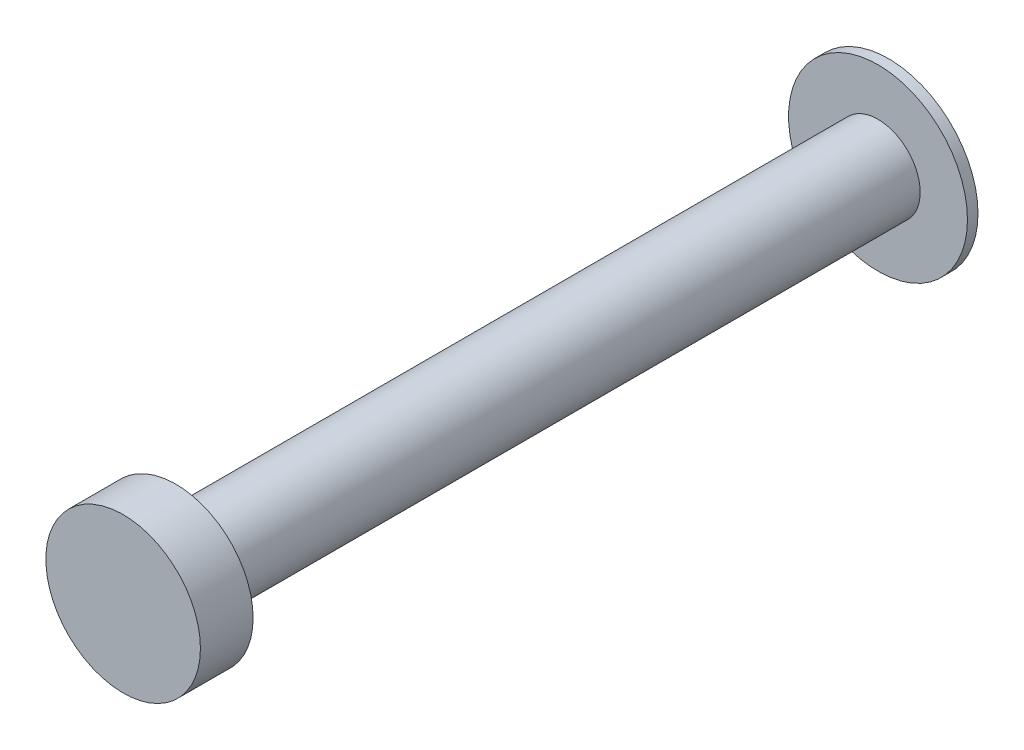
ISO-10303-21;
HEADER;
FILE_DESCRIPTION(('STEP AP214'),'2;1');
FILE_NAME('part.step','',(''),(''),'','','');
FILE_SCHEMA(('AUTOMOTIVE_DESIGN { 1 0 10303 214 1 1 1 1 }'));
ENDSEC;
DATA;
#1=APPLICATION_CONTEXT('core data for automotive mechanical design processes');
#2=APPLICATION_PROTOCOL_DEFINITION('international standard','automotive_design',2000,#1);
#3=PRODUCT_CONTEXT('',#1,'mechanical');
#4=PRODUCT('Part','Part','',(#3));
#5=PRODUCT_RELATED_PRODUCT_CATEGORY('part','',(#4));
#6=PRODUCT_DEFINITION_FORMATION('','',#4);
#7=PRODUCT_DEFINITION_CONTEXT('part definition',#1,'design');
#8=PRODUCT_DEFINITION('design','',#6,#7);
#9=PRODUCT_DEFINITION_SHAPE('','',#8);
#10=(LENGTH_UNIT() NAMED_UNIT(*) SI_UNIT(.MILLI.,.METRE.));
#11=(NAMED_UNIT(*) PLANE_ANGLE_UNIT() SI_UNIT($,.RADIAN.));
#12=(NAMED_UNIT(*) SI_UNIT($,.STERADIAN.) SOLID_ANGLE_UNIT());
#13=UNCERTAINTY_MEASURE_WITH_UNIT(LENGTH_MEASURE(1.E-05),#10,'distance_accuracy_value','');
#14=(GEOMETRIC_REPRESENTATION_CONTEXT(3) GLOBAL_UNCERTAINTY_ASSIGNED_CONTEXT((#13)) GLOBAL_UNIT_ASSIGNED_CONTEXT((#10,
#11,#12)) REPRESENTATION_CONTEXT('',''));
#15=CARTESIAN_POINT('',(0.,0.,0.));
#16=DIRECTION('',(0.,0.,1.));
#17=DIRECTION('',(1.,0.,0.));
#18=AXIS2_PLACEMENT_3D('',#15,#16,#17);
#19=CARTESIAN_POINT('',(-124.4203125,0.,159.88903125));
#20=DIRECTION('',(0.,0.,1.));
#21=DIRECTION('',(1.,0.,0.));
#22=AXIS2_PLACEMENT_3D('',#19,#20,#21);
#23=CYLINDRICAL_SURFACE('',#22,16.1671);
#24=CARTESIAN_POINT('',(-124.4203125,0.,21.5352312499995));
#25=DIRECTION('',(0.,0.,1.));
#26=DIRECTION('',(1.,0.,0.));
#27=AXIS2_PLACEMENT_3D('',#24,#25,#26);
#28=CIRCLE('',#27,16.1671);
#29=CARTESIAN_POINT('',(-108.2532125,0.,21.5352312499995));
#30=VERTEX_POINT('',#29);
#31=EDGE_CURVE('E56',#30,#30,#28,.T.);
#32=ORIENTED_EDGE('',*,*,#31,.T.);
#33=EDGE_LOOP('',(#32));
#34=FACE_BOUND('',#33,.T.);
#35=CARTESIAN_POINT('',(-124.4203125,0.,23.4402312499996));
#36=DIRECTION('',(0.,0.,1.));
#37=DIRECTION('',(1.,0.,0.));
#38=AXIS2_PLACEMENT_3D('',#35,#36,#37);
#39=CIRCLE('',#38,16.1671);
#40=CARTESIAN_POINT('',(-108.2532125,0.,23.4402312499996));
#41=VERTEX_POINT('',#40);
#42=EDGE_CURVE('E10',#41,#41,#39,.T.);
#43=ORIENTED_EDGE('',*,*,#42,.F.);
#44=EDGE_LOOP('',(#43));
#45=FACE_BOUND('',#44,.T.);
#46=ADVANCED_FACE('F34',(#34,#45),#23,.T.);
#47=CARTESIAN_POINT('',(-108.2532125,0.,23.4402312499995));
#48=DIRECTION('',(0.,0.,1.));
#49=DIRECTION('',(1.,0.,0.));
#50=AXIS2_PLACEMENT_3D('',#47,#48,#49);
#51=PLANE('',#50);
#52=ORIENTED_EDGE('',*,*,#42,.T.);
#53=EDGE_LOOP('',(#52));
#54=FACE_BOUND('',#53,.T.);
#55=CARTESIAN_POINT('',(-124.4203125,0.,23.4402312499995));
#56=DIRECTION('',(0.,0.,1.));
#57=DIRECTION('',(1.,0.,0.));
#58=AXIS2_PLACEMENT_3D('',#55,#56,#57);
#59=CIRCLE('',#58,7.62);
#60=CARTESIAN_POINT('',(-116.8003125,0.,23.4402312499995));
#61=VERTEX_POINT('',#60);
#62=EDGE_CURVE('E40',#61,#61,#59,.T.);
#63=ORIENTED_EDGE('',*,*,#62,.F.);
#64=EDGE_LOOP('',(#63));
#65=FACE_BOUND('',#64,.T.);
#66=ADVANCED_FACE('F73',(#54,#65),#51,.T.);
#67=CARTESIAN_POINT('',(-124.4203125,0.,159.88903125));
#68=DIRECTION('',(0.,0.,1.));
#69=DIRECTION('',(1.,0.,0.));
#70=AXIS2_PLACEMENT_3D('',#67,#68,#69);
#71=CYLINDRICAL_SURFACE('',#70,7.62000000000001);
#72=ORIENTED_EDGE('',*,*,#62,.T.);
#73=EDGE_LOOP('',(#72));
#74=FACE_BOUND('',#73,.T.);
#75=CARTESIAN_POINT('',(-124.4203125,0.,150.364031249999));
#76=DIRECTION('',(0.,0.,1.));
#77=DIRECTION('',(1.,0.,0.));
#78=AXIS2_PLACEMENT_3D('',#75,#76,#77);
#79=CIRCLE('',#78,7.62000000000002);
#80=CARTESIAN_POINT('',(-116.8003125,0.,150.364031249999));
#81=VERTEX_POINT('',#80);
#82=EDGE_CURVE('E44',#81,#81,#79,.T.);
#83=ORIENTED_EDGE('',*,*,#82,.F.);
#84=EDGE_LOOP('',(#83));
#85=FACE_BOUND('',#84,.T.);
#86=ADVANCED_FACE('F77',(#74,#85),#71,.T.);
#87=CARTESIAN_POINT('',(-116.8003125,0.,150.364031249999));
#88=DIRECTION('',(0.,0.,-1.));
#89=DIRECTION('',(-1.,0.,0.));
#90=AXIS2_PLACEMENT_3D('',#87,#88,#89);
#91=PLANE('',#90);
#92=ORIENTED_EDGE('',*,*,#82,.T.);
#93=EDGE_LOOP('',(#92));
#94=FACE_BOUND('',#93,.T.);
#95=CARTESIAN_POINT('',(-124.4203125,0.,150.364031249999));
#96=DIRECTION('',(0.,0.,1.));
#97=DIRECTION('',(1.,0.,0.));
#98=AXIS2_PLACEMENT_3D('',#95,#96,#97);
#99=CIRCLE('',#98,13.97);
#100=CARTESIAN_POINT('',(-110.4503125,0.,150.364031249999));
#101=VERTEX_POINT('',#100);
#102=EDGE_CURVE('E48',#101,#101,#99,.T.);
#103=ORIENTED_EDGE('',*,*,#102,.F.);
#104=EDGE_LOOP('',(#103));
#105=FACE_BOUND('',#104,.T.);
#106=ADVANCED_FACE('F81',(#94,#105),#91,.T.);
#107=CARTESIAN_POINT('',(-124.4203125,0.,159.88903125));
#108=DIRECTION('',(0.,0.,1.));
#109=DIRECTION('',(1.,0.,0.));
#110=AXIS2_PLACEMENT_3D('',#107,#108,#109);
#111=CYLINDRICAL_SURFACE('',#110,13.97);
#112=ORIENTED_EDGE('',*,*,#102,.T.);
#113=EDGE_LOOP('',(#112));
#114=FACE_BOUND('',#113,.T.);
#115=CARTESIAN_POINT('',(-124.4203125,0.,159.88903125));
#116=DIRECTION('',(0.,0.,1.));
#117=DIRECTION('',(1.,0.,0.));
#118=AXIS2_PLACEMENT_3D('',#115,#116,#117);
#119=CIRCLE('',#118,13.97);
#120=CARTESIAN_POINT('',(-110.4503125,0.,159.88903125));
#121=VERTEX_POINT('',#120);
#122=EDGE_CURVE('E53',#121,#121,#119,.T.);
#123=ORIENTED_EDGE('',*,*,#122,.F.);
#124=EDGE_LOOP('',(#123));
#125=FACE_BOUND('',#124,.T.);
#126=ADVANCED_FACE('F69',(#114,#125),#111,.T.);
#127=CARTESIAN_POINT('',(-110.4503125,0.,159.88903125));
#128=DIRECTION('',(0.,0.,1.));
#129=DIRECTION('',(1.,0.,0.));
#130=AXIS2_PLACEMENT_3D('',#127,#128,#129);
#131=PLANE('',#130);
#132=ORIENTED_EDGE('',*,*,#122,.T.);
#133=EDGE_LOOP('',(#132));
#134=FACE_BOUND('',#133,.T.);
#135=ADVANCED_FACE('F64',(#134),#131,.T.);
#136=CARTESIAN_POINT('',(-124.4203125,0.,21.5352312499995));
#137=DIRECTION('',(0.,0.,-1.));
#138=DIRECTION('',(-1.,0.,0.));
#139=AXIS2_PLACEMENT_3D('',#136,#137,#138);
#140=PLANE('',#139);
#141=ORIENTED_EDGE('',*,*,#31,.F.);
#142=EDGE_LOOP('',(#141));
#143=FACE_BOUND('',#142,.T.);
#144=ADVANCED_FACE('F62',(#143),#140,.T.);
#145=CLOSED_SHELL('',(#46,#66,#86,#106,#126,#135,#144));
#146=MANIFOLD_SOLID_BREP('B2',#145);
#147=ADVANCED_BREP_SHAPE_REPRESENTATION('',(#18,#146),#14);
#148=SHAPE_DEFINITION_REPRESENTATION(#9,#147);
ENDSEC;
END-ISO-10303-21;
